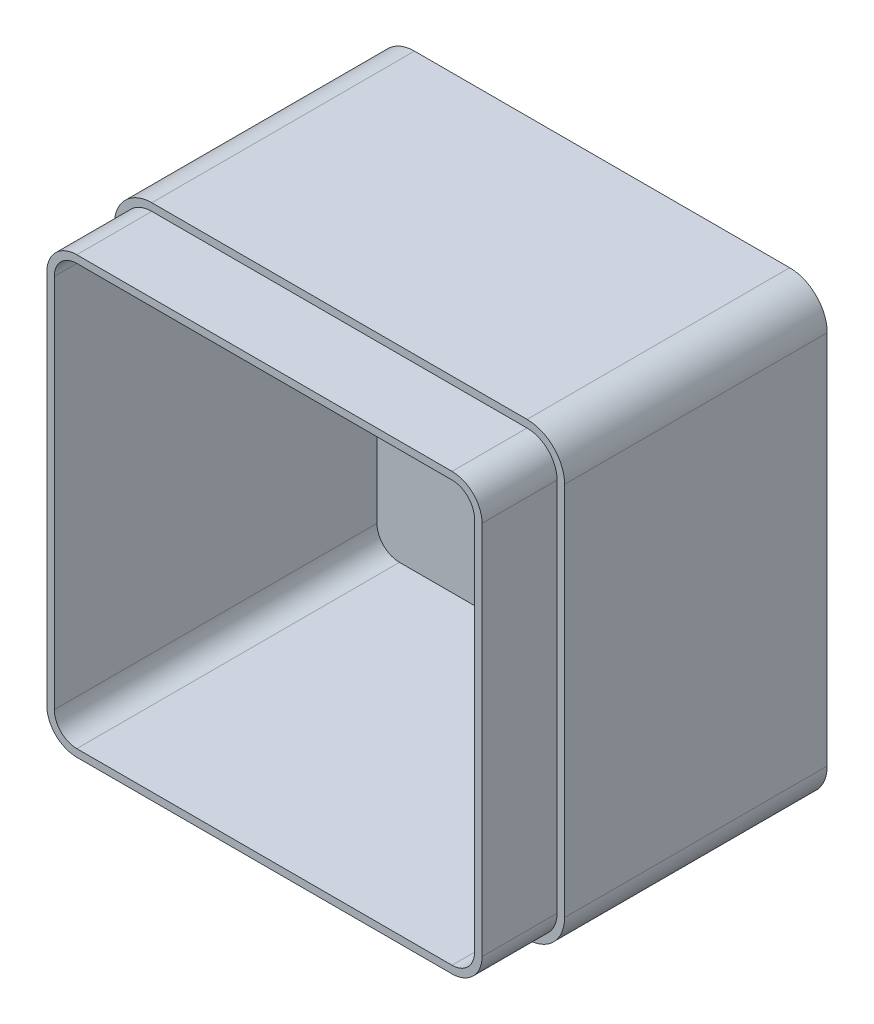
ISO-10303-21;
HEADER;
FILE_DESCRIPTION(('STEP AP214'),'2;1');
FILE_NAME('part.step','',(''),(''),'','','');
FILE_SCHEMA(('AUTOMOTIVE_DESIGN { 1 0 10303 214 1 1 1 1 }'));
ENDSEC;
DATA;
#1=APPLICATION_CONTEXT('core data for automotive mechanical design processes');
#2=APPLICATION_PROTOCOL_DEFINITION('international standard','automotive_design',2000,#1);
#3=PRODUCT_CONTEXT('',#1,'mechanical');
#4=PRODUCT('Part','Part','',(#3));
#5=PRODUCT_RELATED_PRODUCT_CATEGORY('part','',(#4));
#6=PRODUCT_DEFINITION_FORMATION('','',#4);
#7=PRODUCT_DEFINITION_CONTEXT('part definition',#1,'design');
#8=PRODUCT_DEFINITION('design','',#6,#7);
#9=PRODUCT_DEFINITION_SHAPE('','',#8);
#10=(LENGTH_UNIT() NAMED_UNIT(*) SI_UNIT(.MILLI.,.METRE.));
#11=(NAMED_UNIT(*) PLANE_ANGLE_UNIT() SI_UNIT($,.RADIAN.));
#12=(NAMED_UNIT(*) SI_UNIT($,.STERADIAN.) SOLID_ANGLE_UNIT());
#13=UNCERTAINTY_MEASURE_WITH_UNIT(LENGTH_MEASURE(1.E-05),#10,'distance_accuracy_value','');
#14=(GEOMETRIC_REPRESENTATION_CONTEXT(3) GLOBAL_UNCERTAINTY_ASSIGNED_CONTEXT((#13)) GLOBAL_UNIT_ASSIGNED_CONTEXT((#10,
#11,#12)) REPRESENTATION_CONTEXT('',''));
#15=CARTESIAN_POINT('',(0.,0.,0.));
#16=DIRECTION('',(0.,0.,1.));
#17=DIRECTION('',(1.,0.,0.));
#18=AXIS2_PLACEMENT_3D('',#15,#16,#17);
#19=CARTESIAN_POINT('',(0.,0.,4.));
#20=DIRECTION('',(0.,0.,-1.));
#21=DIRECTION('',(-1.,0.,0.));
#22=AXIS2_PLACEMENT_3D('',#19,#20,#21);
#23=PLANE('',#22);
#24=DIRECTION('',(1.,0.,0.));
#25=VECTOR('',#24,1.);
#26=CARTESIAN_POINT('',(0.,-56.,4.));
#27=LINE('',#26,#25);
#28=CARTESIAN_POINT('',(-50.,-56.,4.));
#29=VERTEX_POINT('',#28);
#30=CARTESIAN_POINT('',(50.,-56.,4.));
#31=VERTEX_POINT('',#30);
#32=EDGE_CURVE('E344',#29,#31,#27,.T.);
#33=ORIENTED_EDGE('',*,*,#32,.T.);
#34=CARTESIAN_POINT('',(50.,-50.,4.));
#35=DIRECTION('',(0.,0.,-1.));
#36=DIRECTION('',(-1.,0.,0.));
#37=AXIS2_PLACEMENT_3D('',#34,#35,#36);
#38=CIRCLE('',#37,6.);
#39=CARTESIAN_POINT('',(56.,-50.,4.));
#40=VERTEX_POINT('',#39);
#41=EDGE_CURVE('E360',#40,#31,#38,.T.);
#42=ORIENTED_EDGE('',*,*,#41,.F.);
#43=DIRECTION('',(0.,1.,0.));
#44=VECTOR('',#43,1.);
#45=CARTESIAN_POINT('',(56.,0.,4.));
#46=LINE('',#45,#44);
#47=CARTESIAN_POINT('',(56.,50.,4.));
#48=VERTEX_POINT('',#47);
#49=EDGE_CURVE('E337',#40,#48,#46,.T.);
#50=ORIENTED_EDGE('',*,*,#49,.T.);
#51=CARTESIAN_POINT('',(50.,50.,4.));
#52=DIRECTION('',(0.,0.,-1.));
#53=DIRECTION('',(-1.,0.,0.));
#54=AXIS2_PLACEMENT_3D('',#51,#52,#53);
#55=CIRCLE('',#54,6.);
#56=CARTESIAN_POINT('',(50.,56.,4.));
#57=VERTEX_POINT('',#56);
#58=EDGE_CURVE('E211',#57,#48,#55,.T.);
#59=ORIENTED_EDGE('',*,*,#58,.F.);
#60=DIRECTION('',(-1.,0.,0.));
#61=VECTOR('',#60,1.);
#62=CARTESIAN_POINT('',(0.,56.,4.));
#63=LINE('',#62,#61);
#64=CARTESIAN_POINT('',(-50.,56.,4.));
#65=VERTEX_POINT('',#64);
#66=EDGE_CURVE('E342',#57,#65,#63,.T.);
#67=ORIENTED_EDGE('',*,*,#66,.T.);
#68=CARTESIAN_POINT('',(-50.,50.,4.));
#69=DIRECTION('',(0.,0.,-1.));
#70=DIRECTION('',(-1.,0.,0.));
#71=AXIS2_PLACEMENT_3D('',#68,#69,#70);
#72=CIRCLE('',#71,6.);
#73=CARTESIAN_POINT('',(-56.,50.,4.));
#74=VERTEX_POINT('',#73);
#75=EDGE_CURVE('E354',#74,#65,#72,.T.);
#76=ORIENTED_EDGE('',*,*,#75,.F.);
#77=DIRECTION('',(0.,-1.,0.));
#78=VECTOR('',#77,1.);
#79=CARTESIAN_POINT('',(-56.,0.,4.));
#80=LINE('',#79,#78);
#81=CARTESIAN_POINT('',(-56.,-50.,4.));
#82=VERTEX_POINT('',#81);
#83=EDGE_CURVE('E349',#74,#82,#80,.T.);
#84=ORIENTED_EDGE('',*,*,#83,.T.);
#85=CARTESIAN_POINT('',(-50.,-50.,4.));
#86=DIRECTION('',(0.,0.,-1.));
#87=DIRECTION('',(-1.,0.,0.));
#88=AXIS2_PLACEMENT_3D('',#85,#86,#87);
#89=CIRCLE('',#88,6.);
#90=EDGE_CURVE('E350',#29,#82,#89,.T.);
#91=ORIENTED_EDGE('',*,*,#90,.F.);
#92=EDGE_LOOP('',(#33,#42,#50,#59,#67,#76,#84,#91));
#93=FACE_BOUND('',#92,.T.);
#94=ADVANCED_FACE('F41',(#93),#23,.F.);
#95=CARTESIAN_POINT('',(-50.,-50.,70.));
#96=DIRECTION('',(0.,0.,-1.));
#97=DIRECTION('',(-1.,0.,0.));
#98=AXIS2_PLACEMENT_3D('',#95,#96,#97);
#99=CYLINDRICAL_SURFACE('',#98,6.);
#100=DIRECTION('',(0.,0.,-1.));
#101=VECTOR('',#100,1.);
#102=CARTESIAN_POINT('',(-56.,-50.,70.));
#103=LINE('',#102,#101);
#104=CARTESIAN_POINT('',(-56.,-50.,90.));
#105=VERTEX_POINT('',#104);
#106=EDGE_CURVE('E374',#82,#105,#103,.F.);
#107=ORIENTED_EDGE('',*,*,#106,.T.);
#108=CARTESIAN_POINT('',(-50.,-50.,90.));
#109=DIRECTION('',(0.,0.,1.));
#110=DIRECTION('',(1.,0.,0.));
#111=AXIS2_PLACEMENT_3D('',#108,#109,#110);
#112=CIRCLE('',#111,6.);
#113=CARTESIAN_POINT('',(-50.,-56.,90.));
#114=VERTEX_POINT('',#113);
#115=EDGE_CURVE('E243',#105,#114,#112,.T.);
#116=ORIENTED_EDGE('',*,*,#115,.T.);
#117=DIRECTION('',(0.,0.,1.));
#118=VECTOR('',#117,1.);
#119=CARTESIAN_POINT('',(-50.,-56.,70.));
#120=LINE('',#119,#118);
#121=EDGE_CURVE('E366',#114,#29,#120,.F.);
#122=ORIENTED_EDGE('',*,*,#121,.T.);
#123=ORIENTED_EDGE('',*,*,#90,.T.);
#124=EDGE_LOOP('',(#107,#116,#122,#123));
#125=FACE_BOUND('',#124,.T.);
#126=ADVANCED_FACE('F507',(#125),#99,.F.);
#127=CARTESIAN_POINT('',(-60.,-56.,70.));
#128=DIRECTION('',(0.,1.,0.));
#129=DIRECTION('',(0.,0.,1.));
#130=AXIS2_PLACEMENT_3D('',#127,#128,#129);
#131=PLANE('',#130);
#132=ORIENTED_EDGE('',*,*,#121,.F.);
#133=DIRECTION('',(1.,0.,0.));
#134=VECTOR('',#133,1.);
#135=CARTESIAN_POINT('',(-50.,-56.,90.));
#136=LINE('',#135,#134);
#137=CARTESIAN_POINT('',(50.,-56.,90.));
#138=VERTEX_POINT('',#137);
#139=EDGE_CURVE('E247',#114,#138,#136,.T.);
#140=ORIENTED_EDGE('',*,*,#139,.T.);
#141=DIRECTION('',(0.,0.,1.));
#142=VECTOR('',#141,1.);
#143=CARTESIAN_POINT('',(50.,-56.,70.));
#144=LINE('',#143,#142);
#145=EDGE_CURVE('E348',#31,#138,#144,.T.);
#146=ORIENTED_EDGE('',*,*,#145,.F.);
#147=ORIENTED_EDGE('',*,*,#32,.F.);
#148=EDGE_LOOP('',(#132,#140,#146,#147));
#149=FACE_BOUND('',#148,.T.);
#150=ADVANCED_FACE('F513',(#149),#131,.T.);
#151=CARTESIAN_POINT('',(50.,-50.,70.));
#152=DIRECTION('',(0.,0.,-1.));
#153=DIRECTION('',(-1.,0.,0.));
#154=AXIS2_PLACEMENT_3D('',#151,#152,#153);
#155=CYLINDRICAL_SURFACE('',#154,6.);
#156=ORIENTED_EDGE('',*,*,#145,.T.);
#157=CARTESIAN_POINT('',(50.,-50.,90.));
#158=DIRECTION('',(0.,0.,1.));
#159=DIRECTION('',(1.,0.,0.));
#160=AXIS2_PLACEMENT_3D('',#157,#158,#159);
#161=CIRCLE('',#160,6.);
#162=CARTESIAN_POINT('',(56.,-50.,90.));
#163=VERTEX_POINT('',#162);
#164=EDGE_CURVE('E222',#138,#163,#161,.T.);
#165=ORIENTED_EDGE('',*,*,#164,.T.);
#166=DIRECTION('',(0.,0.,1.));
#167=VECTOR('',#166,1.);
#168=CARTESIAN_POINT('',(56.,-50.,70.));
#169=LINE('',#168,#167);
#170=EDGE_CURVE('E57',#163,#40,#169,.F.);
#171=ORIENTED_EDGE('',*,*,#170,.T.);
#172=ORIENTED_EDGE('',*,*,#41,.T.);
#173=EDGE_LOOP('',(#156,#165,#171,#172));
#174=FACE_BOUND('',#173,.T.);
#175=ADVANCED_FACE('F525',(#174),#155,.F.);
#176=CARTESIAN_POINT('',(56.,-60.,70.));
#177=DIRECTION('',(-1.,0.,0.));
#178=DIRECTION('',(0.,0.,1.));
#179=AXIS2_PLACEMENT_3D('',#176,#177,#178);
#180=PLANE('',#179);
#181=ORIENTED_EDGE('',*,*,#170,.F.);
#182=DIRECTION('',(0.,1.,0.));
#183=VECTOR('',#182,1.);
#184=CARTESIAN_POINT('',(56.,-50.,90.));
#185=LINE('',#184,#183);
#186=CARTESIAN_POINT('',(56.,50.,90.));
#187=VERTEX_POINT('',#186);
#188=EDGE_CURVE('E217',#163,#187,#185,.T.);
#189=ORIENTED_EDGE('',*,*,#188,.T.);
#190=DIRECTION('',(0.,0.,1.));
#191=VECTOR('',#190,1.);
#192=CARTESIAN_POINT('',(56.,50.,70.));
#193=LINE('',#192,#191);
#194=EDGE_CURVE('E205',#48,#187,#193,.T.);
#195=ORIENTED_EDGE('',*,*,#194,.F.);
#196=ORIENTED_EDGE('',*,*,#49,.F.);
#197=EDGE_LOOP('',(#181,#189,#195,#196));
#198=FACE_BOUND('',#197,.T.);
#199=ADVANCED_FACE('F218',(#198),#180,.T.);
#200=CARTESIAN_POINT('',(50.,50.,70.));
#201=DIRECTION('',(0.,0.,-1.));
#202=DIRECTION('',(-1.,0.,0.));
#203=AXIS2_PLACEMENT_3D('',#200,#201,#202);
#204=CYLINDRICAL_SURFACE('',#203,6.);
#205=ORIENTED_EDGE('',*,*,#194,.T.);
#206=CARTESIAN_POINT('',(50.,50.,90.));
#207=DIRECTION('',(0.,0.,1.));
#208=DIRECTION('',(1.,0.,0.));
#209=AXIS2_PLACEMENT_3D('',#206,#207,#208);
#210=CIRCLE('',#209,6.00000000000001);
#211=CARTESIAN_POINT('',(50.,56.,90.));
#212=VERTEX_POINT('',#211);
#213=EDGE_CURVE('E209',#187,#212,#210,.T.);
#214=ORIENTED_EDGE('',*,*,#213,.T.);
#215=DIRECTION('',(0.,0.,-1.));
#216=VECTOR('',#215,1.);
#217=CARTESIAN_POINT('',(50.,56.,70.));
#218=LINE('',#217,#216);
#219=EDGE_CURVE('E371',#212,#57,#218,.T.);
#220=ORIENTED_EDGE('',*,*,#219,.T.);
#221=ORIENTED_EDGE('',*,*,#58,.T.);
#222=EDGE_LOOP('',(#205,#214,#220,#221));
#223=FACE_BOUND('',#222,.T.);
#224=ADVANCED_FACE('F206',(#223),#204,.F.);
#225=CARTESIAN_POINT('',(-60.,56.,70.));
#226=DIRECTION('',(0.,-1.,0.));
#227=DIRECTION('',(0.,0.,-1.));
#228=AXIS2_PLACEMENT_3D('',#225,#226,#227);
#229=PLANE('',#228);
#230=ORIENTED_EDGE('',*,*,#66,.F.);
#231=ORIENTED_EDGE('',*,*,#219,.F.);
#232=DIRECTION('',(-1.,0.,0.));
#233=VECTOR('',#232,1.);
#234=CARTESIAN_POINT('',(50.,56.,90.));
#235=LINE('',#234,#233);
#236=CARTESIAN_POINT('',(-50.,56.,90.));
#237=VERTEX_POINT('',#236);
#238=EDGE_CURVE('E228',#212,#237,#235,.T.);
#239=ORIENTED_EDGE('',*,*,#238,.T.);
#240=DIRECTION('',(0.,0.,-1.));
#241=VECTOR('',#240,1.);
#242=CARTESIAN_POINT('',(-50.,56.,70.));
#243=LINE('',#242,#241);
#244=EDGE_CURVE('E214',#65,#237,#243,.F.);
#245=ORIENTED_EDGE('',*,*,#244,.F.);
#246=EDGE_LOOP('',(#230,#231,#239,#245));
#247=FACE_BOUND('',#246,.T.);
#248=ADVANCED_FACE('F523',(#247),#229,.T.);
#249=CARTESIAN_POINT('',(-50.,50.,70.));
#250=DIRECTION('',(0.,0.,-1.));
#251=DIRECTION('',(-1.,0.,0.));
#252=AXIS2_PLACEMENT_3D('',#249,#250,#251);
#253=CYLINDRICAL_SURFACE('',#252,6.);
#254=ORIENTED_EDGE('',*,*,#244,.T.);
#255=CARTESIAN_POINT('',(-50.,50.,90.));
#256=DIRECTION('',(0.,0.,1.));
#257=DIRECTION('',(1.,0.,0.));
#258=AXIS2_PLACEMENT_3D('',#255,#256,#257);
#259=CIRCLE('',#258,6.00000000000001);
#260=CARTESIAN_POINT('',(-56.,50.,90.));
#261=VERTEX_POINT('',#260);
#262=EDGE_CURVE('E232',#237,#261,#259,.T.);
#263=ORIENTED_EDGE('',*,*,#262,.T.);
#264=DIRECTION('',(0.,0.,-1.));
#265=VECTOR('',#264,1.);
#266=CARTESIAN_POINT('',(-56.,50.,70.));
#267=LINE('',#266,#265);
#268=EDGE_CURVE('E353',#261,#74,#267,.T.);
#269=ORIENTED_EDGE('',*,*,#268,.T.);
#270=ORIENTED_EDGE('',*,*,#75,.T.);
#271=EDGE_LOOP('',(#254,#263,#269,#270));
#272=FACE_BOUND('',#271,.T.);
#273=ADVANCED_FACE('F519',(#272),#253,.F.);
#274=CARTESIAN_POINT('',(-56.,-60.,70.));
#275=DIRECTION('',(1.,0.,0.));
#276=DIRECTION('',(0.,0.,-1.));
#277=AXIS2_PLACEMENT_3D('',#274,#275,#276);
#278=PLANE('',#277);
#279=ORIENTED_EDGE('',*,*,#83,.F.);
#280=ORIENTED_EDGE('',*,*,#268,.F.);
#281=DIRECTION('',(0.,-1.,0.));
#282=VECTOR('',#281,1.);
#283=CARTESIAN_POINT('',(-56.,50.,90.));
#284=LINE('',#283,#282);
#285=EDGE_CURVE('E239',#261,#105,#284,.T.);
#286=ORIENTED_EDGE('',*,*,#285,.T.);
#287=ORIENTED_EDGE('',*,*,#106,.F.);
#288=EDGE_LOOP('',(#279,#280,#286,#287));
#289=FACE_BOUND('',#288,.T.);
#290=ADVANCED_FACE('F522',(#289),#278,.T.);
#291=CARTESIAN_POINT('',(0.,0.,70.));
#292=DIRECTION('',(0.,0.,-1.));
#293=DIRECTION('',(-1.,0.,0.));
#294=AXIS2_PLACEMENT_3D('',#291,#292,#293);
#295=PLANE('',#294);
#296=DIRECTION('',(0.,-1.,0.));
#297=VECTOR('',#296,1.);
#298=CARTESIAN_POINT('',(-60.,-60.,70.));
#299=LINE('',#298,#297);
#300=CARTESIAN_POINT('',(-60.,50.,70.));
#301=VERTEX_POINT('',#300);
#302=CARTESIAN_POINT('',(-60.,-50.,70.));
#303=VERTEX_POINT('',#302);
#304=EDGE_CURVE('E394',#301,#303,#299,.T.);
#305=ORIENTED_EDGE('',*,*,#304,.T.);
#306=CARTESIAN_POINT('',(-50.,-50.,70.));
#307=DIRECTION('',(0.,0.,-1.));
#308=DIRECTION('',(-1.,0.,0.));
#309=AXIS2_PLACEMENT_3D('',#306,#307,#308);
#310=CIRCLE('',#309,10.);
#311=CARTESIAN_POINT('',(-50.,-60.,70.));
#312=VERTEX_POINT('',#311);
#313=EDGE_CURVE('E451',#303,#312,#310,.F.);
#314=ORIENTED_EDGE('',*,*,#313,.T.);
#315=DIRECTION('',(1.,0.,0.));
#316=VECTOR('',#315,1.);
#317=CARTESIAN_POINT('',(-60.,-60.,70.));
#318=LINE('',#317,#316);
#319=CARTESIAN_POINT('',(50.,-60.,70.));
#320=VERTEX_POINT('',#319);
#321=EDGE_CURVE('E398',#312,#320,#318,.T.);
#322=ORIENTED_EDGE('',*,*,#321,.T.);
#323=CARTESIAN_POINT('',(50.,-50.,70.));
#324=DIRECTION('',(0.,0.,-1.));
#325=DIRECTION('',(-1.,0.,0.));
#326=AXIS2_PLACEMENT_3D('',#323,#324,#325);
#327=CIRCLE('',#326,10.);
#328=CARTESIAN_POINT('',(60.,-50.,70.));
#329=VERTEX_POINT('',#328);
#330=EDGE_CURVE('E445',#320,#329,#327,.F.);
#331=ORIENTED_EDGE('',*,*,#330,.T.);
#332=DIRECTION('',(0.,1.,0.));
#333=VECTOR('',#332,1.);
#334=CARTESIAN_POINT('',(60.,-60.,70.));
#335=LINE('',#334,#333);
#336=CARTESIAN_POINT('',(60.,50.,70.));
#337=VERTEX_POINT('',#336);
#338=EDGE_CURVE('E385',#329,#337,#335,.T.);
#339=ORIENTED_EDGE('',*,*,#338,.T.);
#340=CARTESIAN_POINT('',(50.,50.,70.));
#341=DIRECTION('',(0.,0.,-1.));
#342=DIRECTION('',(-1.,0.,0.));
#343=AXIS2_PLACEMENT_3D('',#340,#341,#342);
#344=CIRCLE('',#343,10.);
#345=CARTESIAN_POINT('',(50.,60.,70.));
#346=VERTEX_POINT('',#345);
#347=EDGE_CURVE('E442',#337,#346,#344,.F.);
#348=ORIENTED_EDGE('',*,*,#347,.T.);
#349=DIRECTION('',(-1.,0.,0.));
#350=VECTOR('',#349,1.);
#351=CARTESIAN_POINT('',(-60.,60.,70.));
#352=LINE('',#351,#350);
#353=CARTESIAN_POINT('',(-50.,60.,70.));
#354=VERTEX_POINT('',#353);
#355=EDGE_CURVE('E389',#346,#354,#352,.T.);
#356=ORIENTED_EDGE('',*,*,#355,.T.);
#357=CARTESIAN_POINT('',(-50.,50.,70.));
#358=DIRECTION('',(0.,0.,-1.));
#359=DIRECTION('',(-1.,0.,0.));
#360=AXIS2_PLACEMENT_3D('',#357,#358,#359);
#361=CIRCLE('',#360,10.);
#362=EDGE_CURVE('E448',#354,#301,#361,.F.);
#363=ORIENTED_EDGE('',*,*,#362,.T.);
#364=EDGE_LOOP('',(#305,#314,#322,#331,#339,#348,#356,#363));
#365=FACE_BOUND('',#364,.T.);
#366=CARTESIAN_POINT('',(50.,-50.,70.));
#367=DIRECTION('',(0.,0.,1.));
#368=DIRECTION('',(1.,0.,0.));
#369=AXIS2_PLACEMENT_3D('',#366,#367,#368);
#370=CIRCLE('',#369,8.);
#371=CARTESIAN_POINT('',(50.,-58.,70.));
#372=VERTEX_POINT('',#371);
#373=CARTESIAN_POINT('',(58.,-50.,70.));
#374=VERTEX_POINT('',#373);
#375=EDGE_CURVE('E65',#372,#374,#370,.T.);
#376=ORIENTED_EDGE('',*,*,#375,.F.);
#377=DIRECTION('',(1.,0.,0.));
#378=VECTOR('',#377,1.);
#379=CARTESIAN_POINT('',(-50.,-58.,70.));
#380=LINE('',#379,#378);
#381=CARTESIAN_POINT('',(-50.,-58.,70.));
#382=VERTEX_POINT('',#381);
#383=EDGE_CURVE('E256',#382,#372,#380,.T.);
#384=ORIENTED_EDGE('',*,*,#383,.F.);
#385=CARTESIAN_POINT('',(-50.,-50.,70.));
#386=DIRECTION('',(0.,0.,1.));
#387=DIRECTION('',(1.,0.,0.));
#388=AXIS2_PLACEMENT_3D('',#385,#386,#387);
#389=CIRCLE('',#388,8.);
#390=CARTESIAN_POINT('',(-58.,-50.,70.));
#391=VERTEX_POINT('',#390);
#392=EDGE_CURVE('E300',#391,#382,#389,.T.);
#393=ORIENTED_EDGE('',*,*,#392,.F.);
#394=DIRECTION('',(0.,-1.,0.));
#395=VECTOR('',#394,1.);
#396=CARTESIAN_POINT('',(-58.,50.,70.));
#397=LINE('',#396,#395);
#398=CARTESIAN_POINT('',(-58.,50.,70.));
#399=VERTEX_POINT('',#398);
#400=EDGE_CURVE('E296',#399,#391,#397,.T.);
#401=ORIENTED_EDGE('',*,*,#400,.F.);
#402=CARTESIAN_POINT('',(-50.,50.,70.));
#403=DIRECTION('',(0.,0.,1.));
#404=DIRECTION('',(1.,0.,0.));
#405=AXIS2_PLACEMENT_3D('',#402,#403,#404);
#406=CIRCLE('',#405,8.);
#407=CARTESIAN_POINT('',(-50.,58.,70.));
#408=VERTEX_POINT('',#407);
#409=EDGE_CURVE('E292',#408,#399,#406,.T.);
#410=ORIENTED_EDGE('',*,*,#409,.F.);
#411=DIRECTION('',(-1.,0.,0.));
#412=VECTOR('',#411,1.);
#413=CARTESIAN_POINT('',(50.,58.,70.));
#414=LINE('',#413,#412);
#415=CARTESIAN_POINT('',(50.,58.,70.));
#416=VERTEX_POINT('',#415);
#417=EDGE_CURVE('E288',#416,#408,#414,.T.);
#418=ORIENTED_EDGE('',*,*,#417,.F.);
#419=CARTESIAN_POINT('',(50.,50.,70.));
#420=DIRECTION('',(0.,0.,1.));
#421=DIRECTION('',(1.,0.,0.));
#422=AXIS2_PLACEMENT_3D('',#419,#420,#421);
#423=CIRCLE('',#422,8.00000000000001);
#424=CARTESIAN_POINT('',(58.,50.,70.));
#425=VERTEX_POINT('',#424);
#426=EDGE_CURVE('E284',#425,#416,#423,.T.);
#427=ORIENTED_EDGE('',*,*,#426,.F.);
#428=DIRECTION('',(0.,1.,0.));
#429=VECTOR('',#428,1.);
#430=CARTESIAN_POINT('',(58.,-50.,70.));
#431=LINE('',#430,#429);
#432=EDGE_CURVE('E280',#374,#425,#431,.T.);
#433=ORIENTED_EDGE('',*,*,#432,.F.);
#434=EDGE_LOOP('',(#376,#384,#393,#401,#410,#418,#427,#433));
#435=FACE_BOUND('',#434,.T.);
#436=ADVANCED_FACE('F470',(#365,#435),#295,.F.);
#437=CARTESIAN_POINT('',(60.,-60.,70.));
#438=DIRECTION('',(-1.,0.,0.));
#439=DIRECTION('',(0.,0.,1.));
#440=AXIS2_PLACEMENT_3D('',#437,#438,#439);
#441=PLANE('',#440);
#442=ORIENTED_EDGE('',*,*,#338,.F.);
#443=DIRECTION('',(0.,0.,-1.));
#444=VECTOR('',#443,1.);
#445=CARTESIAN_POINT('',(60.,-50.,70.));
#446=LINE('',#445,#444);
#447=CARTESIAN_POINT('',(60.,-50.,0.));
#448=VERTEX_POINT('',#447);
#449=EDGE_CURVE('E11',#329,#448,#446,.T.);
#450=ORIENTED_EDGE('',*,*,#449,.T.);
#451=DIRECTION('',(0.,1.,0.));
#452=VECTOR('',#451,1.);
#453=CARTESIAN_POINT('',(60.,-60.,0.));
#454=LINE('',#453,#452);
#455=CARTESIAN_POINT('',(60.,50.,0.));
#456=VERTEX_POINT('',#455);
#457=EDGE_CURVE('E340',#448,#456,#454,.T.);
#458=ORIENTED_EDGE('',*,*,#457,.T.);
#459=DIRECTION('',(0.,0.,-1.));
#460=VECTOR('',#459,1.);
#461=CARTESIAN_POINT('',(60.,50.,70.));
#462=LINE('',#461,#460);
#463=EDGE_CURVE('E50',#456,#337,#462,.F.);
#464=ORIENTED_EDGE('',*,*,#463,.T.);
#465=EDGE_LOOP('',(#442,#450,#458,#464));
#466=FACE_BOUND('',#465,.T.);
#467=ADVANCED_FACE('F464',(#466),#441,.F.);
#468=CARTESIAN_POINT('',(-60.,60.,70.));
#469=DIRECTION('',(0.,-1.,0.));
#470=DIRECTION('',(0.,0.,-1.));
#471=AXIS2_PLACEMENT_3D('',#468,#469,#470);
#472=PLANE('',#471);
#473=DIRECTION('',(-1.,0.,0.));
#474=VECTOR('',#473,1.);
#475=CARTESIAN_POINT('',(-60.,60.,0.));
#476=LINE('',#475,#474);
#477=CARTESIAN_POINT('',(50.,60.,0.));
#478=VERTEX_POINT('',#477);
#479=CARTESIAN_POINT('',(-50.,60.,0.));
#480=VERTEX_POINT('',#479);
#481=EDGE_CURVE('E406',#478,#480,#476,.T.);
#482=ORIENTED_EDGE('',*,*,#481,.T.);
#483=DIRECTION('',(0.,0.,-1.));
#484=VECTOR('',#483,1.);
#485=CARTESIAN_POINT('',(-50.,60.,70.));
#486=LINE('',#485,#484);
#487=EDGE_CURVE('E458',#480,#354,#486,.F.);
#488=ORIENTED_EDGE('',*,*,#487,.T.);
#489=ORIENTED_EDGE('',*,*,#355,.F.);
#490=DIRECTION('',(0.,0.,-1.));
#491=VECTOR('',#490,1.);
#492=CARTESIAN_POINT('',(50.,60.,70.));
#493=LINE('',#492,#491);
#494=EDGE_CURVE('E454',#346,#478,#493,.T.);
#495=ORIENTED_EDGE('',*,*,#494,.T.);
#496=EDGE_LOOP('',(#482,#488,#489,#495));
#497=FACE_BOUND('',#496,.T.);
#498=ADVANCED_FACE('F476',(#497),#472,.F.);
#499=CARTESIAN_POINT('',(-60.,-60.,70.));
#500=DIRECTION('',(1.,0.,0.));
#501=DIRECTION('',(0.,0.,-1.));
#502=AXIS2_PLACEMENT_3D('',#499,#500,#501);
#503=PLANE('',#502);
#504=DIRECTION('',(0.,-1.,0.));
#505=VECTOR('',#504,1.);
#506=CARTESIAN_POINT('',(-60.,-60.,0.));
#507=LINE('',#506,#505);
#508=CARTESIAN_POINT('',(-60.,50.,0.));
#509=VERTEX_POINT('',#508);
#510=CARTESIAN_POINT('',(-60.,-50.,0.));
#511=VERTEX_POINT('',#510);
#512=EDGE_CURVE('E410',#509,#511,#507,.T.);
#513=ORIENTED_EDGE('',*,*,#512,.T.);
#514=DIRECTION('',(0.,0.,-1.));
#515=VECTOR('',#514,1.);
#516=CARTESIAN_POINT('',(-60.,-50.,70.));
#517=LINE('',#516,#515);
#518=EDGE_CURVE('E439',#511,#303,#517,.F.);
#519=ORIENTED_EDGE('',*,*,#518,.T.);
#520=ORIENTED_EDGE('',*,*,#304,.F.);
#521=DIRECTION('',(0.,0.,-1.));
#522=VECTOR('',#521,1.);
#523=CARTESIAN_POINT('',(-60.,50.,70.));
#524=LINE('',#523,#522);
#525=EDGE_CURVE('E435',#301,#509,#524,.T.);
#526=ORIENTED_EDGE('',*,*,#525,.T.);
#527=EDGE_LOOP('',(#513,#519,#520,#526));
#528=FACE_BOUND('',#527,.T.);
#529=ADVANCED_FACE('F488',(#528),#503,.F.);
#530=CARTESIAN_POINT('',(-60.,-60.,70.));
#531=DIRECTION('',(0.,1.,0.));
#532=DIRECTION('',(0.,0.,1.));
#533=AXIS2_PLACEMENT_3D('',#530,#531,#532);
#534=PLANE('',#533);
#535=ORIENTED_EDGE('',*,*,#321,.F.);
#536=DIRECTION('',(0.,0.,-1.));
#537=VECTOR('',#536,1.);
#538=CARTESIAN_POINT('',(-50.,-60.,70.));
#539=LINE('',#538,#537);
#540=CARTESIAN_POINT('',(-50.,-60.,0.));
#541=VERTEX_POINT('',#540);
#542=EDGE_CURVE('E419',#312,#541,#539,.T.);
#543=ORIENTED_EDGE('',*,*,#542,.T.);
#544=DIRECTION('',(1.,0.,0.));
#545=VECTOR('',#544,1.);
#546=CARTESIAN_POINT('',(-60.,-60.,0.));
#547=LINE('',#546,#545);
#548=CARTESIAN_POINT('',(50.,-60.,0.));
#549=VERTEX_POINT('',#548);
#550=EDGE_CURVE('E390',#541,#549,#547,.T.);
#551=ORIENTED_EDGE('',*,*,#550,.T.);
#552=DIRECTION('',(0.,0.,-1.));
#553=VECTOR('',#552,1.);
#554=CARTESIAN_POINT('',(50.,-60.,70.));
#555=LINE('',#554,#553);
#556=EDGE_CURVE('E402',#549,#320,#555,.F.);
#557=ORIENTED_EDGE('',*,*,#556,.T.);
#558=EDGE_LOOP('',(#535,#543,#551,#557));
#559=FACE_BOUND('',#558,.T.);
#560=ADVANCED_FACE('F496',(#559),#534,.F.);
#561=CARTESIAN_POINT('',(0.,0.,0.));
#562=DIRECTION('',(0.,0.,-1.));
#563=DIRECTION('',(-1.,0.,0.));
#564=AXIS2_PLACEMENT_3D('',#561,#562,#563);
#565=PLANE('',#564);
#566=ORIENTED_EDGE('',*,*,#550,.F.);
#567=CARTESIAN_POINT('',(-50.,-50.,0.));
#568=DIRECTION('',(0.,0.,-1.));
#569=DIRECTION('',(-1.,0.,0.));
#570=AXIS2_PLACEMENT_3D('',#567,#568,#569);
#571=CIRCLE('',#570,10.);
#572=EDGE_CURVE('E432',#541,#511,#571,.T.);
#573=ORIENTED_EDGE('',*,*,#572,.T.);
#574=ORIENTED_EDGE('',*,*,#512,.F.);
#575=CARTESIAN_POINT('',(-50.,50.,0.));
#576=DIRECTION('',(0.,0.,-1.));
#577=DIRECTION('',(-1.,0.,0.));
#578=AXIS2_PLACEMENT_3D('',#575,#576,#577);
#579=CIRCLE('',#578,10.);
#580=EDGE_CURVE('E429',#509,#480,#579,.T.);
#581=ORIENTED_EDGE('',*,*,#580,.T.);
#582=ORIENTED_EDGE('',*,*,#481,.F.);
#583=CARTESIAN_POINT('',(50.,50.,0.));
#584=DIRECTION('',(0.,0.,-1.));
#585=DIRECTION('',(-1.,0.,0.));
#586=AXIS2_PLACEMENT_3D('',#583,#584,#585);
#587=CIRCLE('',#586,10.);
#588=EDGE_CURVE('E423',#478,#456,#587,.T.);
#589=ORIENTED_EDGE('',*,*,#588,.T.);
#590=ORIENTED_EDGE('',*,*,#457,.F.);
#591=CARTESIAN_POINT('',(50.,-50.,0.));
#592=DIRECTION('',(0.,0.,-1.));
#593=DIRECTION('',(-1.,0.,0.));
#594=AXIS2_PLACEMENT_3D('',#591,#592,#593);
#595=CIRCLE('',#594,10.);
#596=EDGE_CURVE('E426',#448,#549,#595,.T.);
#597=ORIENTED_EDGE('',*,*,#596,.T.);
#598=EDGE_LOOP('',(#566,#573,#574,#581,#582,#589,#590,#597));
#599=FACE_BOUND('',#598,.T.);
#600=ADVANCED_FACE('F480',(#599),#565,.T.);
#601=CARTESIAN_POINT('',(-50.,-50.,70.));
#602=DIRECTION('',(0.,0.,-1.));
#603=DIRECTION('',(-1.,0.,0.));
#604=AXIS2_PLACEMENT_3D('',#601,#602,#603);
#605=CYLINDRICAL_SURFACE('',#604,10.);
#606=ORIENTED_EDGE('',*,*,#313,.F.);
#607=ORIENTED_EDGE('',*,*,#518,.F.);
#608=ORIENTED_EDGE('',*,*,#572,.F.);
#609=ORIENTED_EDGE('',*,*,#542,.F.);
#610=EDGE_LOOP('',(#606,#607,#608,#609));
#611=FACE_BOUND('',#610,.T.);
#612=ADVANCED_FACE('F494',(#611),#605,.T.);
#613=CARTESIAN_POINT('',(-50.,50.,70.));
#614=DIRECTION('',(0.,0.,-1.));
#615=DIRECTION('',(-1.,0.,0.));
#616=AXIS2_PLACEMENT_3D('',#613,#614,#615);
#617=CYLINDRICAL_SURFACE('',#616,10.);
#618=ORIENTED_EDGE('',*,*,#362,.F.);
#619=ORIENTED_EDGE('',*,*,#487,.F.);
#620=ORIENTED_EDGE('',*,*,#580,.F.);
#621=ORIENTED_EDGE('',*,*,#525,.F.);
#622=EDGE_LOOP('',(#618,#619,#620,#621));
#623=FACE_BOUND('',#622,.T.);
#624=ADVANCED_FACE('F485',(#623),#617,.T.);
#625=CARTESIAN_POINT('',(50.,-50.,70.));
#626=DIRECTION('',(0.,0.,-1.));
#627=DIRECTION('',(-1.,0.,0.));
#628=AXIS2_PLACEMENT_3D('',#625,#626,#627);
#629=CYLINDRICAL_SURFACE('',#628,10.);
#630=ORIENTED_EDGE('',*,*,#330,.F.);
#631=ORIENTED_EDGE('',*,*,#556,.F.);
#632=ORIENTED_EDGE('',*,*,#596,.F.);
#633=ORIENTED_EDGE('',*,*,#449,.F.);
#634=EDGE_LOOP('',(#630,#631,#632,#633));
#635=FACE_BOUND('',#634,.T.);
#636=ADVANCED_FACE('F499',(#635),#629,.T.);
#637=CARTESIAN_POINT('',(50.,50.,70.));
#638=DIRECTION('',(0.,0.,-1.));
#639=DIRECTION('',(-1.,0.,0.));
#640=AXIS2_PLACEMENT_3D('',#637,#638,#639);
#641=CYLINDRICAL_SURFACE('',#640,10.);
#642=ORIENTED_EDGE('',*,*,#347,.F.);
#643=ORIENTED_EDGE('',*,*,#463,.F.);
#644=ORIENTED_EDGE('',*,*,#588,.F.);
#645=ORIENTED_EDGE('',*,*,#494,.F.);
#646=EDGE_LOOP('',(#642,#643,#644,#645));
#647=FACE_BOUND('',#646,.T.);
#648=ADVANCED_FACE('F43',(#647),#641,.T.);
#649=CARTESIAN_POINT('',(50.,-50.,90.));
#650=DIRECTION('',(0.,0.,1.));
#651=DIRECTION('',(1.,0.,0.));
#652=AXIS2_PLACEMENT_3D('',#649,#650,#651);
#653=PLANE('',#652);
#654=ORIENTED_EDGE('',*,*,#164,.F.);
#655=ORIENTED_EDGE('',*,*,#139,.F.);
#656=ORIENTED_EDGE('',*,*,#115,.F.);
#657=ORIENTED_EDGE('',*,*,#285,.F.);
#658=ORIENTED_EDGE('',*,*,#262,.F.);
#659=ORIENTED_EDGE('',*,*,#238,.F.);
#660=ORIENTED_EDGE('',*,*,#213,.F.);
#661=ORIENTED_EDGE('',*,*,#188,.F.);
#662=EDGE_LOOP('',(#654,#655,#656,#657,#658,#659,#660,#661));
#663=FACE_BOUND('',#662,.T.);
#664=CARTESIAN_POINT('',(50.,-50.,90.));
#665=DIRECTION('',(0.,0.,1.));
#666=DIRECTION('',(1.,0.,0.));
#667=AXIS2_PLACEMENT_3D('',#664,#665,#666);
#668=CIRCLE('',#667,8.);
#669=CARTESIAN_POINT('',(50.,-58.,90.));
#670=VERTEX_POINT('',#669);
#671=CARTESIAN_POINT('',(58.,-50.,90.));
#672=VERTEX_POINT('',#671);
#673=EDGE_CURVE('E251',#670,#672,#668,.T.);
#674=ORIENTED_EDGE('',*,*,#673,.T.);
#675=DIRECTION('',(0.,1.,0.));
#676=VECTOR('',#675,1.);
#677=CARTESIAN_POINT('',(58.,-50.,90.));
#678=LINE('',#677,#676);
#679=CARTESIAN_POINT('',(58.,50.,90.));
#680=VERTEX_POINT('',#679);
#681=EDGE_CURVE('E255',#672,#680,#678,.T.);
#682=ORIENTED_EDGE('',*,*,#681,.T.);
#683=CARTESIAN_POINT('',(50.,50.,90.));
#684=DIRECTION('',(0.,0.,1.));
#685=DIRECTION('',(1.,0.,0.));
#686=AXIS2_PLACEMENT_3D('',#683,#684,#685);
#687=CIRCLE('',#686,8.00000000000001);
#688=CARTESIAN_POINT('',(50.,58.,90.));
#689=VERTEX_POINT('',#688);
#690=EDGE_CURVE('E259',#680,#689,#687,.T.);
#691=ORIENTED_EDGE('',*,*,#690,.T.);
#692=DIRECTION('',(-1.,0.,0.));
#693=VECTOR('',#692,1.);
#694=CARTESIAN_POINT('',(50.,58.,90.));
#695=LINE('',#694,#693);
#696=CARTESIAN_POINT('',(-50.,58.,90.));
#697=VERTEX_POINT('',#696);
#698=EDGE_CURVE('E262',#689,#697,#695,.T.);
#699=ORIENTED_EDGE('',*,*,#698,.T.);
#700=CARTESIAN_POINT('',(-50.,50.,90.));
#701=DIRECTION('',(0.,0.,1.));
#702=DIRECTION('',(1.,0.,0.));
#703=AXIS2_PLACEMENT_3D('',#700,#701,#702);
#704=CIRCLE('',#703,8.);
#705=CARTESIAN_POINT('',(-58.,50.,90.));
#706=VERTEX_POINT('',#705);
#707=EDGE_CURVE('E265',#697,#706,#704,.T.);
#708=ORIENTED_EDGE('',*,*,#707,.T.);
#709=DIRECTION('',(0.,-1.,0.));
#710=VECTOR('',#709,1.);
#711=CARTESIAN_POINT('',(-58.,50.,90.));
#712=LINE('',#711,#710);
#713=CARTESIAN_POINT('',(-58.,-50.,90.));
#714=VERTEX_POINT('',#713);
#715=EDGE_CURVE('E268',#706,#714,#712,.T.);
#716=ORIENTED_EDGE('',*,*,#715,.T.);
#717=CARTESIAN_POINT('',(-50.,-50.,90.));
#718=DIRECTION('',(0.,0.,1.));
#719=DIRECTION('',(1.,0.,0.));
#720=AXIS2_PLACEMENT_3D('',#717,#718,#719);
#721=CIRCLE('',#720,8.);
#722=CARTESIAN_POINT('',(-50.,-58.,90.));
#723=VERTEX_POINT('',#722);
#724=EDGE_CURVE('E271',#714,#723,#721,.T.);
#725=ORIENTED_EDGE('',*,*,#724,.T.);
#726=DIRECTION('',(1.,0.,0.));
#727=VECTOR('',#726,1.);
#728=CARTESIAN_POINT('',(-50.,-58.,90.));
#729=LINE('',#728,#727);
#730=EDGE_CURVE('E274',#723,#670,#729,.T.);
#731=ORIENTED_EDGE('',*,*,#730,.T.);
#732=EDGE_LOOP('',(#674,#682,#691,#699,#708,#716,#725,#731));
#733=FACE_BOUND('',#732,.T.);
#734=ADVANCED_FACE('F224',(#663,#733),#653,.T.);
#735=CARTESIAN_POINT('',(-50.,-58.,90.));
#736=DIRECTION('',(0.,1.,0.));
#737=DIRECTION('',(0.,0.,1.));
#738=AXIS2_PLACEMENT_3D('',#735,#736,#737);
#739=PLANE('',#738);
#740=ORIENTED_EDGE('',*,*,#383,.T.);
#741=DIRECTION('',(0.,0.,-1.));
#742=VECTOR('',#741,1.);
#743=CARTESIAN_POINT('',(50.,-58.,90.));
#744=LINE('',#743,#742);
#745=EDGE_CURVE('E277',#670,#372,#744,.T.);
#746=ORIENTED_EDGE('',*,*,#745,.F.);
#747=ORIENTED_EDGE('',*,*,#730,.F.);
#748=DIRECTION('',(0.,0.,-1.));
#749=VECTOR('',#748,1.);
#750=CARTESIAN_POINT('',(-50.,-58.,90.));
#751=LINE('',#750,#749);
#752=EDGE_CURVE('E309',#723,#382,#751,.T.);
#753=ORIENTED_EDGE('',*,*,#752,.T.);
#754=EDGE_LOOP('',(#740,#746,#747,#753));
#755=FACE_BOUND('',#754,.T.);
#756=ADVANCED_FACE('F584',(#755),#739,.F.);
#757=CARTESIAN_POINT('',(-50.,-50.,90.));
#758=DIRECTION('',(0.,0.,-1.));
#759=DIRECTION('',(-1.,0.,0.));
#760=AXIS2_PLACEMENT_3D('',#757,#758,#759);
#761=CYLINDRICAL_SURFACE('',#760,8.);
#762=ORIENTED_EDGE('',*,*,#392,.T.);
#763=ORIENTED_EDGE('',*,*,#752,.F.);
#764=ORIENTED_EDGE('',*,*,#724,.F.);
#765=DIRECTION('',(0.,0.,-1.));
#766=VECTOR('',#765,1.);
#767=CARTESIAN_POINT('',(-58.,-50.,90.));
#768=LINE('',#767,#766);
#769=EDGE_CURVE('E313',#714,#391,#768,.T.);
#770=ORIENTED_EDGE('',*,*,#769,.T.);
#771=EDGE_LOOP('',(#762,#763,#764,#770));
#772=FACE_BOUND('',#771,.T.);
#773=ADVANCED_FACE('F589',(#772),#761,.T.);
#774=CARTESIAN_POINT('',(-58.,50.,90.));
#775=DIRECTION('',(1.,0.,0.));
#776=DIRECTION('',(0.,0.,-1.));
#777=AXIS2_PLACEMENT_3D('',#774,#775,#776);
#778=PLANE('',#777);
#779=ORIENTED_EDGE('',*,*,#400,.T.);
#780=ORIENTED_EDGE('',*,*,#769,.F.);
#781=ORIENTED_EDGE('',*,*,#715,.F.);
#782=DIRECTION('',(0.,0.,-1.));
#783=VECTOR('',#782,1.);
#784=CARTESIAN_POINT('',(-58.,50.,90.));
#785=LINE('',#784,#783);
#786=EDGE_CURVE('E317',#706,#399,#785,.T.);
#787=ORIENTED_EDGE('',*,*,#786,.T.);
#788=EDGE_LOOP('',(#779,#780,#781,#787));
#789=FACE_BOUND('',#788,.T.);
#790=ADVANCED_FACE('F599',(#789),#778,.F.);
#791=CARTESIAN_POINT('',(-50.,50.,90.));
#792=DIRECTION('',(0.,0.,-1.));
#793=DIRECTION('',(-1.,0.,0.));
#794=AXIS2_PLACEMENT_3D('',#791,#792,#793);
#795=CYLINDRICAL_SURFACE('',#794,8.);
#796=ORIENTED_EDGE('',*,*,#409,.T.);
#797=ORIENTED_EDGE('',*,*,#786,.F.);
#798=ORIENTED_EDGE('',*,*,#707,.F.);
#799=DIRECTION('',(0.,0.,-1.));
#800=VECTOR('',#799,1.);
#801=CARTESIAN_POINT('',(-50.,58.,90.));
#802=LINE('',#801,#800);
#803=EDGE_CURVE('E321',#697,#408,#802,.T.);
#804=ORIENTED_EDGE('',*,*,#803,.T.);
#805=EDGE_LOOP('',(#796,#797,#798,#804));
#806=FACE_BOUND('',#805,.T.);
#807=ADVANCED_FACE('F609',(#806),#795,.T.);
#808=CARTESIAN_POINT('',(50.,58.,90.));
#809=DIRECTION('',(0.,-1.,0.));
#810=DIRECTION('',(1.,0.,0.));
#811=AXIS2_PLACEMENT_3D('',#808,#809,#810);
#812=PLANE('',#811);
#813=ORIENTED_EDGE('',*,*,#417,.T.);
#814=ORIENTED_EDGE('',*,*,#803,.F.);
#815=ORIENTED_EDGE('',*,*,#698,.F.);
#816=DIRECTION('',(0.,0.,-1.));
#817=VECTOR('',#816,1.);
#818=CARTESIAN_POINT('',(50.,58.,90.));
#819=LINE('',#818,#817);
#820=EDGE_CURVE('E325',#689,#416,#819,.T.);
#821=ORIENTED_EDGE('',*,*,#820,.T.);
#822=EDGE_LOOP('',(#813,#814,#815,#821));
#823=FACE_BOUND('',#822,.T.);
#824=ADVANCED_FACE('F619',(#823),#812,.F.);
#825=CARTESIAN_POINT('',(50.,50.,90.));
#826=DIRECTION('',(0.,0.,-1.));
#827=DIRECTION('',(-1.,0.,0.));
#828=AXIS2_PLACEMENT_3D('',#825,#826,#827);
#829=CYLINDRICAL_SURFACE('',#828,8.00000000000001);
#830=ORIENTED_EDGE('',*,*,#426,.T.);
#831=ORIENTED_EDGE('',*,*,#820,.F.);
#832=ORIENTED_EDGE('',*,*,#690,.F.);
#833=DIRECTION('',(0.,0.,-1.));
#834=VECTOR('',#833,1.);
#835=CARTESIAN_POINT('',(58.,50.,90.));
#836=LINE('',#835,#834);
#837=EDGE_CURVE('E329',#680,#425,#836,.T.);
#838=ORIENTED_EDGE('',*,*,#837,.T.);
#839=EDGE_LOOP('',(#830,#831,#832,#838));
#840=FACE_BOUND('',#839,.T.);
#841=ADVANCED_FACE('F629',(#840),#829,.T.);
#842=CARTESIAN_POINT('',(58.,-50.,90.));
#843=DIRECTION('',(-1.,0.,0.));
#844=DIRECTION('',(0.,0.,1.));
#845=AXIS2_PLACEMENT_3D('',#842,#843,#844);
#846=PLANE('',#845);
#847=ORIENTED_EDGE('',*,*,#432,.T.);
#848=ORIENTED_EDGE('',*,*,#837,.F.);
#849=ORIENTED_EDGE('',*,*,#681,.F.);
#850=DIRECTION('',(0.,0.,-1.));
#851=VECTOR('',#850,1.);
#852=CARTESIAN_POINT('',(58.,-50.,90.));
#853=LINE('',#852,#851);
#854=EDGE_CURVE('E333',#672,#374,#853,.T.);
#855=ORIENTED_EDGE('',*,*,#854,.T.);
#856=EDGE_LOOP('',(#847,#848,#849,#855));
#857=FACE_BOUND('',#856,.T.);
#858=ADVANCED_FACE('F639',(#857),#846,.F.);
#859=CARTESIAN_POINT('',(50.,-50.,90.));
#860=DIRECTION('',(0.,0.,-1.));
#861=DIRECTION('',(-1.,0.,0.));
#862=AXIS2_PLACEMENT_3D('',#859,#860,#861);
#863=CYLINDRICAL_SURFACE('',#862,8.);
#864=ORIENTED_EDGE('',*,*,#375,.T.);
#865=ORIENTED_EDGE('',*,*,#854,.F.);
#866=ORIENTED_EDGE('',*,*,#673,.F.);
#867=ORIENTED_EDGE('',*,*,#745,.T.);
#868=EDGE_LOOP('',(#864,#865,#866,#867));
#869=FACE_BOUND('',#868,.T.);
#870=ADVANCED_FACE('F649',(#869),#863,.T.);
#871=CLOSED_SHELL('',(#94,#126,#150,#175,#199,#224,#248,#273,#290,#436,#467,#498,#529,#560,#600,
#612,#624,#636,#648,#734,#756,#773,#790,#807,#824,#841,#858,#870));
#872=MANIFOLD_SOLID_BREP('B2',#871);
#873=ADVANCED_BREP_SHAPE_REPRESENTATION('',(#18,#872),#14);
#874=SHAPE_DEFINITION_REPRESENTATION(#9,#873);
ENDSEC;
END-ISO-10303-21;
